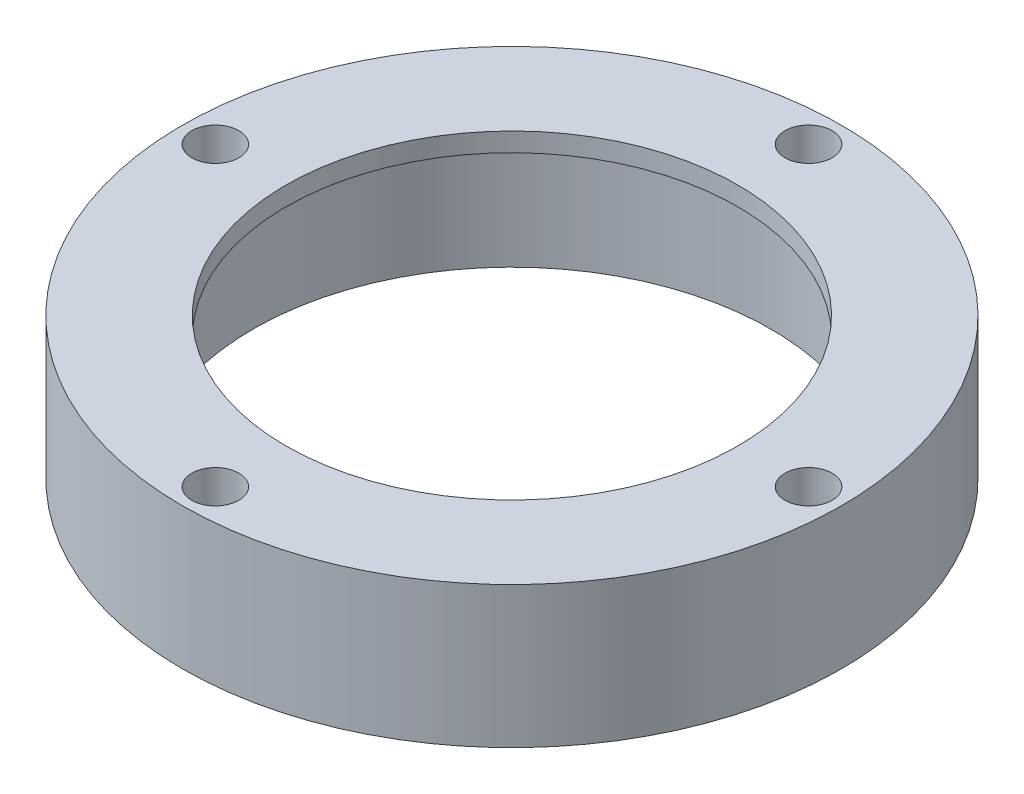
ISO-10303-21;
HEADER;
FILE_DESCRIPTION(('STEP AP214'),'2;1');
FILE_NAME('part.step','',(''),(''),'','','');
FILE_SCHEMA(('AUTOMOTIVE_DESIGN { 1 0 10303 214 1 1 1 1 }'));
ENDSEC;
DATA;
#1=APPLICATION_CONTEXT('core data for automotive mechanical design processes');
#2=APPLICATION_PROTOCOL_DEFINITION('international standard','automotive_design',2000,#1);
#3=PRODUCT_CONTEXT('',#1,'mechanical');
#4=PRODUCT('Part','Part','',(#3));
#5=PRODUCT_RELATED_PRODUCT_CATEGORY('part','',(#4));
#6=PRODUCT_DEFINITION_FORMATION('','',#4);
#7=PRODUCT_DEFINITION_CONTEXT('part definition',#1,'design');
#8=PRODUCT_DEFINITION('design','',#6,#7);
#9=PRODUCT_DEFINITION_SHAPE('','',#8);
#10=(LENGTH_UNIT() NAMED_UNIT(*) SI_UNIT(.MILLI.,.METRE.));
#11=(NAMED_UNIT(*) PLANE_ANGLE_UNIT() SI_UNIT($,.RADIAN.));
#12=(NAMED_UNIT(*) SI_UNIT($,.STERADIAN.) SOLID_ANGLE_UNIT());
#13=UNCERTAINTY_MEASURE_WITH_UNIT(LENGTH_MEASURE(1.E-05),#10,'distance_accuracy_value','');
#14=(GEOMETRIC_REPRESENTATION_CONTEXT(3) GLOBAL_UNCERTAINTY_ASSIGNED_CONTEXT((#13)) GLOBAL_UNIT_ASSIGNED_CONTEXT((#10,
#11,#12)) REPRESENTATION_CONTEXT('',''));
#15=CARTESIAN_POINT('',(0.,0.,0.));
#16=DIRECTION('',(0.,0.,1.));
#17=DIRECTION('',(1.,0.,0.));
#18=AXIS2_PLACEMENT_3D('',#15,#16,#17);
#19=CARTESIAN_POINT('',(0.,60.6098006644518,0.));
#20=DIRECTION('',(0.,1.,0.));
#21=DIRECTION('',(0.,0.,1.));
#22=AXIS2_PLACEMENT_3D('',#19,#20,#21);
#23=CYLINDRICAL_SURFACE('',#22,35.);
#24=CARTESIAN_POINT('',(0.,14.7848750217782,0.));
#25=DIRECTION('',(0.,1.,0.));
#26=DIRECTION('',(0.,0.,1.));
#27=AXIS2_PLACEMENT_3D('',#24,#25,#26);
#28=CIRCLE('',#27,35.);
#29=CARTESIAN_POINT('',(0.,14.7848750217782,35.));
#30=VERTEX_POINT('',#29);
#31=EDGE_CURVE('E50',#30,#30,#28,.T.);
#32=ORIENTED_EDGE('',*,*,#31,.F.);
#33=EDGE_LOOP('',(#32));
#34=FACE_BOUND('',#33,.T.);
#35=CARTESIAN_POINT('',(0.,-0.215124978221792,0.));
#36=DIRECTION('',(0.,1.,0.));
#37=DIRECTION('',(0.,0.,1.));
#38=AXIS2_PLACEMENT_3D('',#35,#36,#37);
#39=CIRCLE('',#38,35.);
#40=CARTESIAN_POINT('',(0.,-0.215124978221792,35.));
#41=VERTEX_POINT('',#40);
#42=EDGE_CURVE('E10',#41,#41,#39,.T.);
#43=ORIENTED_EDGE('',*,*,#42,.T.);
#44=EDGE_LOOP('',(#43));
#45=FACE_BOUND('',#44,.T.);
#46=ADVANCED_FACE('F31',(#34,#45),#23,.T.);
#47=CARTESIAN_POINT('',(35.,-0.215124978221791,0.));
#48=DIRECTION('',(0.,1.,0.));
#49=DIRECTION('',(0.,0.,1.));
#50=AXIS2_PLACEMENT_3D('',#47,#48,#49);
#51=PLANE('',#50);
#52=CARTESIAN_POINT('',(-31.5,-0.215124978221791,0.));
#53=DIRECTION('',(0.,-1.,0.));
#54=DIRECTION('',(0.,0.,-1.));
#55=AXIS2_PLACEMENT_3D('',#52,#53,#54);
#56=CIRCLE('',#55,2.5);
#57=CARTESIAN_POINT('',(-31.5,-0.215124978221791,-2.5));
#58=VERTEX_POINT('',#57);
#59=EDGE_CURVE('E67',#58,#58,#56,.T.);
#60=ORIENTED_EDGE('',*,*,#59,.F.);
#61=EDGE_LOOP('',(#60));
#62=FACE_BOUND('',#61,.T.);
#63=CARTESIAN_POINT('',(31.5,-0.215124978221791,0.));
#64=DIRECTION('',(0.,-1.,0.));
#65=DIRECTION('',(0.,0.,-1.));
#66=AXIS2_PLACEMENT_3D('',#63,#64,#65);
#67=CIRCLE('',#66,2.5);
#68=CARTESIAN_POINT('',(31.5,-0.215124978221791,-2.5));
#69=VERTEX_POINT('',#68);
#70=EDGE_CURVE('E57',#69,#69,#67,.T.);
#71=ORIENTED_EDGE('',*,*,#70,.F.);
#72=EDGE_LOOP('',(#71));
#73=FACE_BOUND('',#72,.T.);
#74=CARTESIAN_POINT('',(0.,-0.215124978221791,-31.5));
#75=DIRECTION('',(0.,-1.,0.));
#76=DIRECTION('',(0.,0.,-1.));
#77=AXIS2_PLACEMENT_3D('',#74,#75,#76);
#78=CIRCLE('',#77,2.5);
#79=CARTESIAN_POINT('',(0.,-0.215124978221791,-34.));
#80=VERTEX_POINT('',#79);
#81=EDGE_CURVE('E54',#80,#80,#78,.T.);
#82=ORIENTED_EDGE('',*,*,#81,.F.);
#83=EDGE_LOOP('',(#82));
#84=FACE_BOUND('',#83,.T.);
#85=CARTESIAN_POINT('',(0.,-0.215124978221791,31.5));
#86=DIRECTION('',(0.,-1.,0.));
#87=DIRECTION('',(0.,0.,-1.));
#88=AXIS2_PLACEMENT_3D('',#85,#86,#87);
#89=CIRCLE('',#88,2.5);
#90=CARTESIAN_POINT('',(0.,-0.215124978221791,29.));
#91=VERTEX_POINT('',#90);
#92=EDGE_CURVE('E51',#91,#91,#89,.T.);
#93=ORIENTED_EDGE('',*,*,#92,.F.);
#94=EDGE_LOOP('',(#93));
#95=FACE_BOUND('',#94,.T.);
#96=ORIENTED_EDGE('',*,*,#42,.F.);
#97=EDGE_LOOP('',(#96));
#98=FACE_BOUND('',#97,.T.);
#99=CARTESIAN_POINT('',(0.,-0.215124978221792,0.));
#100=DIRECTION('',(0.,1.,0.));
#101=DIRECTION('',(0.,0.,1.));
#102=AXIS2_PLACEMENT_3D('',#99,#100,#101);
#103=CIRCLE('',#102,27.5);
#104=CARTESIAN_POINT('',(0.,-0.215124978221792,27.5));
#105=VERTEX_POINT('',#104);
#106=EDGE_CURVE('E38',#105,#105,#103,.T.);
#107=ORIENTED_EDGE('',*,*,#106,.T.);
#108=EDGE_LOOP('',(#107));
#109=FACE_BOUND('',#108,.T.);
#110=ADVANCED_FACE('F105',(#62,#73,#84,#95,#98,#109),#51,.F.);
#111=CARTESIAN_POINT('',(0.,60.6098006644518,0.));
#112=DIRECTION('',(0.,1.,0.));
#113=DIRECTION('',(0.,0.,1.));
#114=AXIS2_PLACEMENT_3D('',#111,#112,#113);
#115=CYLINDRICAL_SURFACE('',#114,27.5);
#116=ORIENTED_EDGE('',*,*,#106,.F.);
#117=EDGE_LOOP('',(#116));
#118=FACE_BOUND('',#117,.T.);
#119=CARTESIAN_POINT('',(0.,12.7848750217782,0.));
#120=DIRECTION('',(0.,1.,0.));
#121=DIRECTION('',(0.,0.,1.));
#122=AXIS2_PLACEMENT_3D('',#119,#120,#121);
#123=CIRCLE('',#122,27.5);
#124=CARTESIAN_POINT('',(0.,12.7848750217782,27.5));
#125=VERTEX_POINT('',#124);
#126=EDGE_CURVE('E43',#125,#125,#123,.T.);
#127=ORIENTED_EDGE('',*,*,#126,.T.);
#128=EDGE_LOOP('',(#127));
#129=FACE_BOUND('',#128,.T.);
#130=ADVANCED_FACE('F82',(#118,#129),#115,.F.);
#131=CARTESIAN_POINT('',(27.5,12.7848750217782,0.));
#132=DIRECTION('',(0.,1.,0.));
#133=DIRECTION('',(0.,0.,1.));
#134=AXIS2_PLACEMENT_3D('',#131,#132,#133);
#135=PLANE('',#134);
#136=ORIENTED_EDGE('',*,*,#126,.F.);
#137=EDGE_LOOP('',(#136));
#138=FACE_BOUND('',#137,.T.);
#139=CARTESIAN_POINT('',(0.,12.7848750217782,0.));
#140=DIRECTION('',(0.,1.,0.));
#141=DIRECTION('',(0.,0.,1.));
#142=AXIS2_PLACEMENT_3D('',#139,#140,#141);
#143=CIRCLE('',#142,24.);
#144=CARTESIAN_POINT('',(0.,12.7848750217782,24.));
#145=VERTEX_POINT('',#144);
#146=EDGE_CURVE('E77',#145,#145,#143,.T.);
#147=ORIENTED_EDGE('',*,*,#146,.T.);
#148=EDGE_LOOP('',(#147));
#149=FACE_BOUND('',#148,.T.);
#150=ADVANCED_FACE('F84',(#138,#149),#135,.F.);
#151=CARTESIAN_POINT('',(0.,60.6098006644518,0.));
#152=DIRECTION('',(0.,1.,0.));
#153=DIRECTION('',(0.,0.,1.));
#154=AXIS2_PLACEMENT_3D('',#151,#152,#153);
#155=CYLINDRICAL_SURFACE('',#154,24.);
#156=ORIENTED_EDGE('',*,*,#146,.F.);
#157=EDGE_LOOP('',(#156));
#158=FACE_BOUND('',#157,.T.);
#159=CARTESIAN_POINT('',(0.,14.7848750217782,0.));
#160=DIRECTION('',(0.,1.,0.));
#161=DIRECTION('',(0.,0.,1.));
#162=AXIS2_PLACEMENT_3D('',#159,#160,#161);
#163=CIRCLE('',#162,24.);
#164=CARTESIAN_POINT('',(0.,14.7848750217782,24.));
#165=VERTEX_POINT('',#164);
#166=EDGE_CURVE('E74',#165,#165,#163,.T.);
#167=ORIENTED_EDGE('',*,*,#166,.T.);
#168=EDGE_LOOP('',(#167));
#169=FACE_BOUND('',#168,.T.);
#170=ADVANCED_FACE('F87',(#158,#169),#155,.F.);
#171=CARTESIAN_POINT('',(24.,14.7848750217782,0.));
#172=DIRECTION('',(0.,-1.,0.));
#173=DIRECTION('',(0.,0.,-1.));
#174=AXIS2_PLACEMENT_3D('',#171,#172,#173);
#175=PLANE('',#174);
#176=CARTESIAN_POINT('',(-31.5,14.7848750217782,0.));
#177=DIRECTION('',(0.,-1.,0.));
#178=DIRECTION('',(0.,0.,-1.));
#179=AXIS2_PLACEMENT_3D('',#176,#177,#178);
#180=CIRCLE('',#179,2.5);
#181=CARTESIAN_POINT('',(-31.5,14.7848750217782,-2.5));
#182=VERTEX_POINT('',#181);
#183=EDGE_CURVE('E34',#182,#182,#180,.T.);
#184=ORIENTED_EDGE('',*,*,#183,.T.);
#185=EDGE_LOOP('',(#184));
#186=FACE_BOUND('',#185,.T.);
#187=CARTESIAN_POINT('',(31.5,14.7848750217782,0.));
#188=DIRECTION('',(0.,-1.,0.));
#189=DIRECTION('',(0.,0.,-1.));
#190=AXIS2_PLACEMENT_3D('',#187,#188,#189);
#191=CIRCLE('',#190,2.5);
#192=CARTESIAN_POINT('',(31.5,14.7848750217782,-2.5));
#193=VERTEX_POINT('',#192);
#194=EDGE_CURVE('E55',#193,#193,#191,.T.);
#195=ORIENTED_EDGE('',*,*,#194,.T.);
#196=EDGE_LOOP('',(#195));
#197=FACE_BOUND('',#196,.T.);
#198=CARTESIAN_POINT('',(0.,14.7848750217782,-31.5));
#199=DIRECTION('',(0.,-1.,0.));
#200=DIRECTION('',(0.,0.,-1.));
#201=AXIS2_PLACEMENT_3D('',#198,#199,#200);
#202=CIRCLE('',#201,2.5);
#203=CARTESIAN_POINT('',(0.,14.7848750217782,-34.));
#204=VERTEX_POINT('',#203);
#205=EDGE_CURVE('E52',#204,#204,#202,.T.);
#206=ORIENTED_EDGE('',*,*,#205,.T.);
#207=EDGE_LOOP('',(#206));
#208=FACE_BOUND('',#207,.T.);
#209=CARTESIAN_POINT('',(0.,14.7848750217782,31.5));
#210=DIRECTION('',(0.,-1.,0.));
#211=DIRECTION('',(0.,0.,-1.));
#212=AXIS2_PLACEMENT_3D('',#209,#210,#211);
#213=CIRCLE('',#212,2.5);
#214=CARTESIAN_POINT('',(0.,14.7848750217782,29.));
#215=VERTEX_POINT('',#214);
#216=EDGE_CURVE('E47',#215,#215,#213,.T.);
#217=ORIENTED_EDGE('',*,*,#216,.T.);
#218=EDGE_LOOP('',(#217));
#219=FACE_BOUND('',#218,.T.);
#220=ORIENTED_EDGE('',*,*,#166,.F.);
#221=EDGE_LOOP('',(#220));
#222=FACE_BOUND('',#221,.T.);
#223=ORIENTED_EDGE('',*,*,#31,.T.);
#224=EDGE_LOOP('',(#223));
#225=FACE_BOUND('',#224,.T.);
#226=ADVANCED_FACE('F93',(#186,#197,#208,#219,#222,#225),#175,.F.);
#227=CARTESIAN_POINT('',(0.,21.7848750217782,31.5));
#228=DIRECTION('',(0.,-1.,0.));
#229=DIRECTION('',(0.,0.,-1.));
#230=AXIS2_PLACEMENT_3D('',#227,#228,#229);
#231=CYLINDRICAL_SURFACE('',#230,2.5);
#232=ORIENTED_EDGE('',*,*,#92,.T.);
#233=EDGE_LOOP('',(#232));
#234=FACE_BOUND('',#233,.T.);
#235=ORIENTED_EDGE('',*,*,#216,.F.);
#236=EDGE_LOOP('',(#235));
#237=FACE_BOUND('',#236,.T.);
#238=ADVANCED_FACE('F99',(#234,#237),#231,.F.);
#239=CARTESIAN_POINT('',(0.,21.7848750217782,-31.5));
#240=DIRECTION('',(0.,-1.,0.));
#241=DIRECTION('',(0.,0.,-1.));
#242=AXIS2_PLACEMENT_3D('',#239,#240,#241);
#243=CYLINDRICAL_SURFACE('',#242,2.5);
#244=ORIENTED_EDGE('',*,*,#81,.T.);
#245=EDGE_LOOP('',(#244));
#246=FACE_BOUND('',#245,.T.);
#247=ORIENTED_EDGE('',*,*,#205,.F.);
#248=EDGE_LOOP('',(#247));
#249=FACE_BOUND('',#248,.T.);
#250=ADVANCED_FACE('F121',(#246,#249),#243,.F.);
#251=CARTESIAN_POINT('',(31.5,21.7848750217782,0.));
#252=DIRECTION('',(0.,-1.,0.));
#253=DIRECTION('',(0.,0.,-1.));
#254=AXIS2_PLACEMENT_3D('',#251,#252,#253);
#255=CYLINDRICAL_SURFACE('',#254,2.5);
#256=ORIENTED_EDGE('',*,*,#70,.T.);
#257=EDGE_LOOP('',(#256));
#258=FACE_BOUND('',#257,.T.);
#259=ORIENTED_EDGE('',*,*,#194,.F.);
#260=EDGE_LOOP('',(#259));
#261=FACE_BOUND('',#260,.T.);
#262=ADVANCED_FACE('F125',(#258,#261),#255,.F.);
#263=CARTESIAN_POINT('',(-31.5,21.7848750217782,0.));
#264=DIRECTION('',(0.,-1.,0.));
#265=DIRECTION('',(0.,0.,-1.));
#266=AXIS2_PLACEMENT_3D('',#263,#264,#265);
#267=CYLINDRICAL_SURFACE('',#266,2.5);
#268=ORIENTED_EDGE('',*,*,#59,.T.);
#269=EDGE_LOOP('',(#268));
#270=FACE_BOUND('',#269,.T.);
#271=ORIENTED_EDGE('',*,*,#183,.F.);
#272=EDGE_LOOP('',(#271));
#273=FACE_BOUND('',#272,.T.);
#274=ADVANCED_FACE('F129',(#270,#273),#267,.F.);
#275=CLOSED_SHELL('',(#46,#110,#130,#150,#170,#226,#238,#250,#262,#274));
#276=MANIFOLD_SOLID_BREP('B2',#275);
#277=ADVANCED_BREP_SHAPE_REPRESENTATION('',(#18,#276),#14);
#278=SHAPE_DEFINITION_REPRESENTATION(#9,#277);
ENDSEC;
END-ISO-10303-21;
